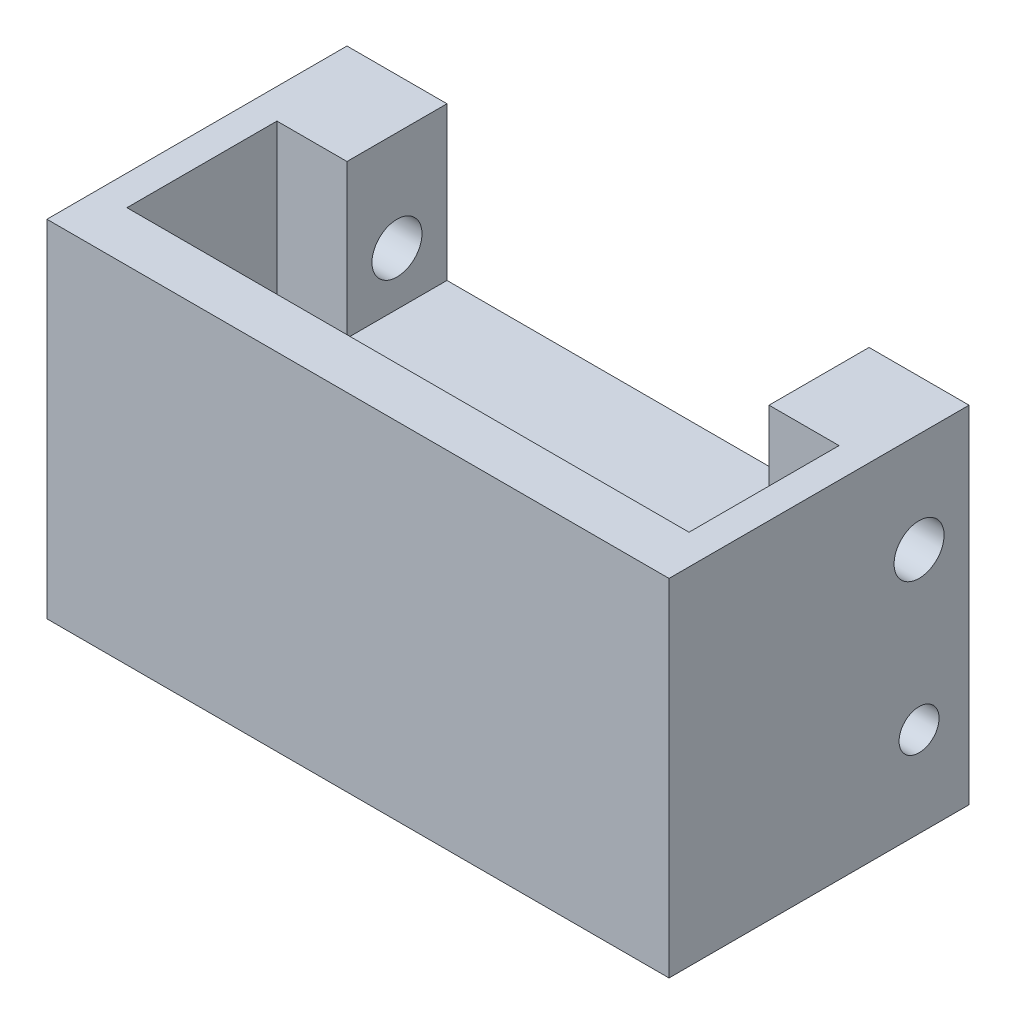
ISO-10303-21;
HEADER;
FILE_DESCRIPTION(('STEP AP214'),'2;1');
FILE_NAME('part.step','',(''),(''),'','','');
FILE_SCHEMA(('AUTOMOTIVE_DESIGN { 1 0 10303 214 1 1 1 1 }'));
ENDSEC;
DATA;
#1=APPLICATION_CONTEXT('core data for automotive mechanical design processes');
#2=APPLICATION_PROTOCOL_DEFINITION('international standard','automotive_design',2000,#1);
#3=PRODUCT_CONTEXT('',#1,'mechanical');
#4=PRODUCT('Part','Part','',(#3));
#5=PRODUCT_RELATED_PRODUCT_CATEGORY('part','',(#4));
#6=PRODUCT_DEFINITION_FORMATION('','',#4);
#7=PRODUCT_DEFINITION_CONTEXT('part definition',#1,'design');
#8=PRODUCT_DEFINITION('design','',#6,#7);
#9=PRODUCT_DEFINITION_SHAPE('','',#8);
#10=(LENGTH_UNIT() NAMED_UNIT(*) SI_UNIT(.MILLI.,.METRE.));
#11=(NAMED_UNIT(*) PLANE_ANGLE_UNIT() SI_UNIT($,.RADIAN.));
#12=(NAMED_UNIT(*) SI_UNIT($,.STERADIAN.) SOLID_ANGLE_UNIT());
#13=UNCERTAINTY_MEASURE_WITH_UNIT(LENGTH_MEASURE(1.E-05),#10,'distance_accuracy_value','');
#14=(GEOMETRIC_REPRESENTATION_CONTEXT(3) GLOBAL_UNCERTAINTY_ASSIGNED_CONTEXT((#13)) GLOBAL_UNIT_ASSIGNED_CONTEXT((#10,
#11,#12)) REPRESENTATION_CONTEXT('',''));
#15=CARTESIAN_POINT('',(0.,0.,0.));
#16=DIRECTION('',(0.,0.,1.));
#17=DIRECTION('',(1.,0.,0.));
#18=AXIS2_PLACEMENT_3D('',#15,#16,#17);
#19=CARTESIAN_POINT('',(0.,0.,12.7));
#20=DIRECTION('',(0.,0.,1.));
#21=DIRECTION('',(1.,0.,0.));
#22=AXIS2_PLACEMENT_3D('',#19,#20,#21);
#23=PLANE('',#22);
#24=DIRECTION('',(1.,0.,0.));
#25=VECTOR('',#24,1.);
#26=CARTESIAN_POINT('',(46.7087107438017,-11.952694214876,12.7));
#27=LINE('',#26,#25);
#28=CARTESIAN_POINT('',(46.7087107438017,-11.952694214876,12.7));
#29=VERTEX_POINT('',#28);
#30=CARTESIAN_POINT('',(55.5987107438017,-11.952694214876,12.7));
#31=VERTEX_POINT('',#30);
#32=EDGE_CURVE('E57',#29,#31,#27,.T.);
#33=ORIENTED_EDGE('',*,*,#32,.T.);
#34=DIRECTION('',(0.,-1.,0.));
#35=VECTOR('',#34,1.);
#36=CARTESIAN_POINT('',(55.5987107438017,31.989305785124,12.7));
#37=LINE('',#36,#35);
#38=CARTESIAN_POINT('',(55.5987107438017,31.989305785124,12.7));
#39=VERTEX_POINT('',#38);
#40=EDGE_CURVE('E189',#39,#31,#37,.T.);
#41=ORIENTED_EDGE('',*,*,#40,.F.);
#42=DIRECTION('',(-1.,0.,0.));
#43=VECTOR('',#42,1.);
#44=CARTESIAN_POINT('',(46.7087107438017,31.989305785124,12.7));
#45=LINE('',#44,#43);
#46=CARTESIAN_POINT('',(46.7087107438017,31.989305785124,12.7));
#47=VERTEX_POINT('',#46);
#48=EDGE_CURVE('E245',#39,#47,#45,.T.);
#49=ORIENTED_EDGE('',*,*,#48,.T.);
#50=DIRECTION('',(0.,-1.,0.));
#51=VECTOR('',#50,1.);
#52=CARTESIAN_POINT('',(46.7087107438017,31.989305785124,12.7));
#53=LINE('',#52,#51);
#54=CARTESIAN_POINT('',(46.7087107438017,12.558305785124,12.7));
#55=VERTEX_POINT('',#54);
#56=EDGE_CURVE('E238',#47,#55,#53,.T.);
#57=ORIENTED_EDGE('',*,*,#56,.T.);
#58=DIRECTION('',(-1.,0.,0.));
#59=VECTOR('',#58,1.);
#60=CARTESIAN_POINT('',(59.4107107438017,12.558305785124,12.7));
#61=LINE('',#60,#59);
#62=CARTESIAN_POINT('',(-6.88528925619834,12.558305785124,12.7));
#63=VERTEX_POINT('',#62);
#64=EDGE_CURVE('E283',#55,#63,#61,.T.);
#65=ORIENTED_EDGE('',*,*,#64,.T.);
#66=DIRECTION('',(0.,1.,0.));
#67=VECTOR('',#66,1.);
#68=CARTESIAN_POINT('',(-6.88528925619834,31.989305785124,12.7));
#69=LINE('',#68,#67);
#70=CARTESIAN_POINT('',(-6.88528925619834,31.989305785124,12.7));
#71=VERTEX_POINT('',#70);
#72=EDGE_CURVE('E319',#63,#71,#69,.T.);
#73=ORIENTED_EDGE('',*,*,#72,.T.);
#74=DIRECTION('',(-1.,0.,0.));
#75=VECTOR('',#74,1.);
#76=CARTESIAN_POINT('',(-19.5852892561983,31.989305785124,12.7));
#77=LINE('',#76,#75);
#78=CARTESIAN_POINT('',(-15.7752892561983,31.989305785124,12.7));
#79=VERTEX_POINT('',#78);
#80=EDGE_CURVE('E325',#71,#79,#77,.T.);
#81=ORIENTED_EDGE('',*,*,#80,.T.);
#82=DIRECTION('',(0.,1.,0.));
#83=VECTOR('',#82,1.);
#84=CARTESIAN_POINT('',(-15.7752892561983,31.989305785124,12.7));
#85=LINE('',#84,#83);
#86=CARTESIAN_POINT('',(-15.7752892561983,-11.952694214876,12.7));
#87=VERTEX_POINT('',#86);
#88=EDGE_CURVE('E64',#87,#79,#85,.T.);
#89=ORIENTED_EDGE('',*,*,#88,.F.);
#90=DIRECTION('',(1.,0.,0.));
#91=VECTOR('',#90,1.);
#92=CARTESIAN_POINT('',(-19.5852892561983,-11.952694214876,12.7));
#93=LINE('',#92,#91);
#94=CARTESIAN_POINT('',(-6.88528925619833,-11.952694214876,12.7));
#95=VERTEX_POINT('',#94);
#96=EDGE_CURVE('E316',#87,#95,#93,.T.);
#97=ORIENTED_EDGE('',*,*,#96,.T.);
#98=CARTESIAN_POINT('',(-6.88528925619834,7.47830578512398,12.7));
#99=VERTEX_POINT('',#98);
#100=EDGE_CURVE('E321',#95,#99,#69,.T.);
#101=ORIENTED_EDGE('',*,*,#100,.T.);
#102=DIRECTION('',(-1.,0.,0.));
#103=VECTOR('',#102,1.);
#104=CARTESIAN_POINT('',(59.4107107438017,7.478305785124,12.7));
#105=LINE('',#104,#103);
#106=CARTESIAN_POINT('',(46.7087107438017,7.478305785124,12.7));
#107=VERTEX_POINT('',#106);
#108=EDGE_CURVE('E284',#107,#99,#105,.T.);
#109=ORIENTED_EDGE('',*,*,#108,.F.);
#110=EDGE_CURVE('E242',#107,#29,#53,.T.);
#111=ORIENTED_EDGE('',*,*,#110,.T.);
#112=EDGE_LOOP('',(#33,#41,#49,#57,#65,#73,#81,#89,#97,#101,#109,#111));
#113=FACE_BOUND('',#112,.T.);
#114=ADVANCED_FACE('F39',(#113),#23,.T.);
#115=CARTESIAN_POINT('',(-6.88528925619834,31.989305785124,12.7));
#116=DIRECTION('',(-1.,0.,0.));
#117=DIRECTION('',(0.,-1.,0.));
#118=AXIS2_PLACEMENT_3D('',#115,#116,#117);
#119=PLANE('',#118);
#120=CARTESIAN_POINT('',(-6.88528925619834,19.289305785124,6.35));
#121=DIRECTION('',(-1.,0.,0.));
#122=DIRECTION('',(0.,-1.,0.));
#123=AXIS2_PLACEMENT_3D('',#120,#121,#122);
#124=CIRCLE('',#123,3.175);
#125=CARTESIAN_POINT('',(-6.88528925619834,16.114305785124,6.35));
#126=VERTEX_POINT('',#125);
#127=EDGE_CURVE('E43',#126,#126,#124,.T.);
#128=ORIENTED_EDGE('',*,*,#127,.T.);
#129=EDGE_LOOP('',(#128));
#130=FACE_BOUND('',#129,.T.);
#131=DIRECTION('',(0.,0.,1.));
#132=VECTOR('',#131,1.);
#133=CARTESIAN_POINT('',(-6.88528925619834,12.558305785124,12.7));
#134=LINE('',#133,#132);
#135=CARTESIAN_POINT('',(-6.88528925619834,12.558305785124,0.));
#136=VERTEX_POINT('',#135);
#137=EDGE_CURVE('E279',#136,#63,#134,.T.);
#138=ORIENTED_EDGE('',*,*,#137,.F.);
#139=DIRECTION('',(0.,1.,0.));
#140=VECTOR('',#139,1.);
#141=CARTESIAN_POINT('',(-6.88528925619834,31.989305785124,0.));
#142=LINE('',#141,#140);
#143=CARTESIAN_POINT('',(-6.88528925619834,31.989305785124,0.));
#144=VERTEX_POINT('',#143);
#145=EDGE_CURVE('E334',#136,#144,#142,.T.);
#146=ORIENTED_EDGE('',*,*,#145,.T.);
#147=DIRECTION('',(0.,0.,-1.));
#148=VECTOR('',#147,1.);
#149=CARTESIAN_POINT('',(-6.88528925619834,31.989305785124,12.7));
#150=LINE('',#149,#148);
#151=EDGE_CURVE('E342',#71,#144,#150,.T.);
#152=ORIENTED_EDGE('',*,*,#151,.F.);
#153=ORIENTED_EDGE('',*,*,#72,.F.);
#154=EDGE_LOOP('',(#138,#146,#152,#153));
#155=FACE_BOUND('',#154,.T.);
#156=ADVANCED_FACE('F356',(#130,#155),#119,.F.);
#157=CARTESIAN_POINT('',(-6.88528925619833,-0.522694214876018,6.35));
#158=DIRECTION('',(-1.,0.,0.));
#159=DIRECTION('',(0.,-1.,0.));
#160=AXIS2_PLACEMENT_3D('',#157,#158,#159);
#161=CIRCLE('',#160,2.54);
#162=CARTESIAN_POINT('',(-6.88528925619833,-3.06269421487602,6.35));
#163=VERTEX_POINT('',#162);
#164=EDGE_CURVE('E312',#163,#163,#161,.T.);
#165=ORIENTED_EDGE('',*,*,#164,.T.);
#166=EDGE_LOOP('',(#165));
#167=FACE_BOUND('',#166,.T.);
#168=DIRECTION('',(0.,0.,-1.));
#169=VECTOR('',#168,1.);
#170=CARTESIAN_POINT('',(-6.88528925619834,7.47830578512398,12.7));
#171=LINE('',#170,#169);
#172=CARTESIAN_POINT('',(-6.88528925619834,7.47830578512398,0.));
#173=VERTEX_POINT('',#172);
#174=EDGE_CURVE('E275',#99,#173,#171,.T.);
#175=ORIENTED_EDGE('',*,*,#174,.F.);
#176=ORIENTED_EDGE('',*,*,#100,.F.);
#177=DIRECTION('',(0.,0.,-1.));
#178=VECTOR('',#177,1.);
#179=CARTESIAN_POINT('',(-6.88528925619833,-11.952694214876,12.7));
#180=LINE('',#179,#178);
#181=CARTESIAN_POINT('',(-6.88528925619833,-11.952694214876,0.));
#182=VERTEX_POINT('',#181);
#183=EDGE_CURVE('E49',#95,#182,#180,.T.);
#184=ORIENTED_EDGE('',*,*,#183,.T.);
#185=EDGE_CURVE('E335',#182,#173,#142,.T.);
#186=ORIENTED_EDGE('',*,*,#185,.T.);
#187=EDGE_LOOP('',(#175,#176,#184,#186));
#188=FACE_BOUND('',#187,.T.);
#189=ADVANCED_FACE('F384',(#167,#188),#119,.F.);
#190=CARTESIAN_POINT('',(-19.5852892561983,31.989305785124,12.7));
#191=DIRECTION('',(1.,0.,0.));
#192=DIRECTION('',(0.,1.,0.));
#193=AXIS2_PLACEMENT_3D('',#190,#191,#192);
#194=PLANE('',#193);
#195=CARTESIAN_POINT('',(-19.5852892561983,19.289305785124,6.35));
#196=DIRECTION('',(-1.,0.,0.));
#197=DIRECTION('',(0.,-1.,0.));
#198=AXIS2_PLACEMENT_3D('',#195,#196,#197);
#199=CIRCLE('',#198,3.175);
#200=CARTESIAN_POINT('',(-19.5852892561983,16.114305785124,6.35));
#201=VERTEX_POINT('',#200);
#202=EDGE_CURVE('E308',#201,#201,#199,.T.);
#203=ORIENTED_EDGE('',*,*,#202,.F.);
#204=EDGE_LOOP('',(#203));
#205=FACE_BOUND('',#204,.T.);
#206=CARTESIAN_POINT('',(-19.5852892561983,-0.52269421487602,6.35));
#207=DIRECTION('',(-1.,0.,0.));
#208=DIRECTION('',(0.,-1.,0.));
#209=AXIS2_PLACEMENT_3D('',#206,#207,#208);
#210=CIRCLE('',#209,2.54);
#211=CARTESIAN_POINT('',(-19.5852892561983,-3.06269421487602,6.35));
#212=VERTEX_POINT('',#211);
#213=EDGE_CURVE('E304',#212,#212,#210,.T.);
#214=ORIENTED_EDGE('',*,*,#213,.F.);
#215=EDGE_LOOP('',(#214));
#216=FACE_BOUND('',#215,.T.);
#217=DIRECTION('',(0.,-1.,0.));
#218=VECTOR('',#217,1.);
#219=CARTESIAN_POINT('',(-19.5852892561983,31.989305785124,0.));
#220=LINE('',#219,#218);
#221=CARTESIAN_POINT('',(-19.5852892561983,31.989305785124,0.));
#222=VERTEX_POINT('',#221);
#223=CARTESIAN_POINT('',(-19.5852892561983,-11.952694214876,0.));
#224=VERTEX_POINT('',#223);
#225=EDGE_CURVE('E160',#222,#224,#220,.T.);
#226=ORIENTED_EDGE('',*,*,#225,.T.);
#227=DIRECTION('',(0.,0.,-1.));
#228=VECTOR('',#227,1.);
#229=CARTESIAN_POINT('',(-19.5852892561983,-11.952694214876,12.7));
#230=LINE('',#229,#228);
#231=CARTESIAN_POINT('',(-19.5852892561983,-11.952694214876,38.1));
#232=VERTEX_POINT('',#231);
#233=EDGE_CURVE('E11',#232,#224,#230,.T.);
#234=ORIENTED_EDGE('',*,*,#233,.F.);
#235=DIRECTION('',(0.,-1.,0.));
#236=VECTOR('',#235,1.);
#237=CARTESIAN_POINT('',(-19.5852892561983,31.989305785124,38.1));
#238=LINE('',#237,#236);
#239=CARTESIAN_POINT('',(-19.5852892561983,31.989305785124,38.1));
#240=VERTEX_POINT('',#239);
#241=EDGE_CURVE('E158',#240,#232,#238,.T.);
#242=ORIENTED_EDGE('',*,*,#241,.F.);
#243=DIRECTION('',(0.,0.,-1.));
#244=VECTOR('',#243,1.);
#245=CARTESIAN_POINT('',(-19.5852892561983,31.989305785124,12.7));
#246=LINE('',#245,#244);
#247=EDGE_CURVE('E328',#240,#222,#246,.T.);
#248=ORIENTED_EDGE('',*,*,#247,.T.);
#249=EDGE_LOOP('',(#226,#234,#242,#248));
#250=FACE_BOUND('',#249,.T.);
#251=ADVANCED_FACE('F41',(#205,#216,#250),#194,.F.);
#252=CARTESIAN_POINT('',(-19.5852892561983,-11.952694214876,12.7));
#253=DIRECTION('',(0.,1.,0.));
#254=DIRECTION('',(0.,0.,1.));
#255=AXIS2_PLACEMENT_3D('',#252,#253,#254);
#256=PLANE('',#255);
#257=DIRECTION('',(1.,0.,0.));
#258=VECTOR('',#257,1.);
#259=CARTESIAN_POINT('',(-19.5852892561983,-11.952694214876,0.));
#260=LINE('',#259,#258);
#261=EDGE_CURVE('E331',#224,#182,#260,.T.);
#262=ORIENTED_EDGE('',*,*,#261,.T.);
#263=ORIENTED_EDGE('',*,*,#183,.F.);
#264=ORIENTED_EDGE('',*,*,#96,.F.);
#265=DIRECTION('',(0.,0.,-1.));
#266=VECTOR('',#265,1.);
#267=CARTESIAN_POINT('',(-15.7752892561983,-11.952694214876,31.75));
#268=LINE('',#267,#266);
#269=CARTESIAN_POINT('',(-15.7752892561983,-11.952694214876,31.75));
#270=VERTEX_POINT('',#269);
#271=EDGE_CURVE('E217',#270,#87,#268,.T.);
#272=ORIENTED_EDGE('',*,*,#271,.F.);
#273=DIRECTION('',(1.,0.,0.));
#274=VECTOR('',#273,1.);
#275=CARTESIAN_POINT('',(-19.5852892561983,-11.952694214876,31.75));
#276=LINE('',#275,#274);
#277=CARTESIAN_POINT('',(55.5987107438017,-11.952694214876,31.75));
#278=VERTEX_POINT('',#277);
#279=EDGE_CURVE('E182',#270,#278,#276,.T.);
#280=ORIENTED_EDGE('',*,*,#279,.T.);
#281=DIRECTION('',(0.,0.,-1.));
#282=VECTOR('',#281,1.);
#283=CARTESIAN_POINT('',(55.5987107438017,-11.952694214876,31.75));
#284=LINE('',#283,#282);
#285=EDGE_CURVE('E197',#278,#31,#284,.T.);
#286=ORIENTED_EDGE('',*,*,#285,.T.);
#287=ORIENTED_EDGE('',*,*,#32,.F.);
#288=DIRECTION('',(0.,0.,-1.));
#289=VECTOR('',#288,1.);
#290=CARTESIAN_POINT('',(46.7087107438017,-11.952694214876,12.7));
#291=LINE('',#290,#289);
#292=CARTESIAN_POINT('',(46.7087107438017,-11.952694214876,0.));
#293=VERTEX_POINT('',#292);
#294=EDGE_CURVE('E271',#29,#293,#291,.T.);
#295=ORIENTED_EDGE('',*,*,#294,.T.);
#296=DIRECTION('',(1.,0.,0.));
#297=VECTOR('',#296,1.);
#298=CARTESIAN_POINT('',(46.7087107438017,-11.952694214876,0.));
#299=LINE('',#298,#297);
#300=CARTESIAN_POINT('',(59.4087107438017,-11.952694214876,0.));
#301=VERTEX_POINT('',#300);
#302=EDGE_CURVE('E253',#293,#301,#299,.T.);
#303=ORIENTED_EDGE('',*,*,#302,.T.);
#304=DIRECTION('',(0.,0.,-1.));
#305=VECTOR('',#304,1.);
#306=CARTESIAN_POINT('',(59.4087107438017,-11.952694214876,12.7));
#307=LINE('',#306,#305);
#308=CARTESIAN_POINT('',(59.4087107438017,-11.952694214876,38.1));
#309=VERTEX_POINT('',#308);
#310=EDGE_CURVE('E166',#309,#301,#307,.T.);
#311=ORIENTED_EDGE('',*,*,#310,.F.);
#312=DIRECTION('',(1.,0.,0.));
#313=VECTOR('',#312,1.);
#314=CARTESIAN_POINT('',(-19.5852892561983,-11.952694214876,38.1));
#315=LINE('',#314,#313);
#316=EDGE_CURVE('E163',#232,#309,#315,.T.);
#317=ORIENTED_EDGE('',*,*,#316,.F.);
#318=ORIENTED_EDGE('',*,*,#233,.T.);
#319=EDGE_LOOP('',(#262,#263,#264,#272,#280,#286,#287,#295,#303,#311,#317,#318));
#320=FACE_BOUND('',#319,.T.);
#321=ADVANCED_FACE('F164',(#320),#256,.F.);
#322=CARTESIAN_POINT('',(-19.5852892561983,31.989305785124,12.7));
#323=DIRECTION('',(0.,-1.,0.));
#324=DIRECTION('',(0.,0.,-1.));
#325=AXIS2_PLACEMENT_3D('',#322,#323,#324);
#326=PLANE('',#325);
#327=DIRECTION('',(-1.,0.,0.));
#328=VECTOR('',#327,1.);
#329=CARTESIAN_POINT('',(-19.5852892561983,31.989305785124,0.));
#330=LINE('',#329,#328);
#331=EDGE_CURVE('E320',#144,#222,#330,.T.);
#332=ORIENTED_EDGE('',*,*,#331,.T.);
#333=ORIENTED_EDGE('',*,*,#247,.F.);
#334=DIRECTION('',(-1.,0.,0.));
#335=VECTOR('',#334,1.);
#336=CARTESIAN_POINT('',(-19.5852892561983,31.989305785124,38.1));
#337=LINE('',#336,#335);
#338=CARTESIAN_POINT('',(59.4087107438017,31.989305785124,38.1));
#339=VERTEX_POINT('',#338);
#340=EDGE_CURVE('E176',#339,#240,#337,.T.);
#341=ORIENTED_EDGE('',*,*,#340,.F.);
#342=DIRECTION('',(0.,0.,-1.));
#343=VECTOR('',#342,1.);
#344=CARTESIAN_POINT('',(59.4087107438017,31.989305785124,12.7));
#345=LINE('',#344,#343);
#346=CARTESIAN_POINT('',(59.4087107438017,31.989305785124,0.));
#347=VERTEX_POINT('',#346);
#348=EDGE_CURVE('E265',#339,#347,#345,.T.);
#349=ORIENTED_EDGE('',*,*,#348,.T.);
#350=DIRECTION('',(-1.,0.,0.));
#351=VECTOR('',#350,1.);
#352=CARTESIAN_POINT('',(46.7087107438017,31.989305785124,0.));
#353=LINE('',#352,#351);
#354=CARTESIAN_POINT('',(46.7087107438017,31.989305785124,0.));
#355=VERTEX_POINT('',#354);
#356=EDGE_CURVE('E259',#347,#355,#353,.T.);
#357=ORIENTED_EDGE('',*,*,#356,.T.);
#358=DIRECTION('',(0.,0.,-1.));
#359=VECTOR('',#358,1.);
#360=CARTESIAN_POINT('',(46.7087107438017,31.989305785124,12.7));
#361=LINE('',#360,#359);
#362=EDGE_CURVE('E248',#47,#355,#361,.T.);
#363=ORIENTED_EDGE('',*,*,#362,.F.);
#364=ORIENTED_EDGE('',*,*,#48,.F.);
#365=DIRECTION('',(0.,0.,-1.));
#366=VECTOR('',#365,1.);
#367=CARTESIAN_POINT('',(55.5987107438017,31.989305785124,31.75));
#368=LINE('',#367,#366);
#369=CARTESIAN_POINT('',(55.5987107438017,31.989305785124,31.75));
#370=VERTEX_POINT('',#369);
#371=EDGE_CURVE('E203',#370,#39,#368,.T.);
#372=ORIENTED_EDGE('',*,*,#371,.F.);
#373=DIRECTION('',(-1.,0.,0.));
#374=VECTOR('',#373,1.);
#375=CARTESIAN_POINT('',(-19.5852892561983,31.989305785124,31.75));
#376=LINE('',#375,#374);
#377=CARTESIAN_POINT('',(-15.7752892561983,31.989305785124,31.75));
#378=VERTEX_POINT('',#377);
#379=EDGE_CURVE('E178',#370,#378,#376,.T.);
#380=ORIENTED_EDGE('',*,*,#379,.T.);
#381=DIRECTION('',(0.,0.,-1.));
#382=VECTOR('',#381,1.);
#383=CARTESIAN_POINT('',(-15.7752892561983,31.989305785124,31.75));
#384=LINE('',#383,#382);
#385=EDGE_CURVE('E211',#378,#79,#384,.T.);
#386=ORIENTED_EDGE('',*,*,#385,.T.);
#387=ORIENTED_EDGE('',*,*,#80,.F.);
#388=ORIENTED_EDGE('',*,*,#151,.T.);
#389=EDGE_LOOP('',(#332,#333,#341,#349,#357,#363,#364,#372,#380,#386,#387,#388));
#390=FACE_BOUND('',#389,.T.);
#391=ADVANCED_FACE('F389',(#390),#326,.F.);
#392=CARTESIAN_POINT('',(0.,0.,0.));
#393=DIRECTION('',(0.,0.,1.));
#394=DIRECTION('',(1.,0.,0.));
#395=AXIS2_PLACEMENT_3D('',#392,#393,#394);
#396=PLANE('',#395);
#397=ORIENTED_EDGE('',*,*,#225,.F.);
#398=ORIENTED_EDGE('',*,*,#331,.F.);
#399=ORIENTED_EDGE('',*,*,#145,.F.);
#400=DIRECTION('',(-1.,0.,0.));
#401=VECTOR('',#400,1.);
#402=CARTESIAN_POINT('',(59.4107107438017,12.558305785124,0.));
#403=LINE('',#402,#401);
#404=CARTESIAN_POINT('',(46.7087107438017,12.558305785124,0.));
#405=VERTEX_POINT('',#404);
#406=EDGE_CURVE('E293',#405,#136,#403,.T.);
#407=ORIENTED_EDGE('',*,*,#406,.F.);
#408=DIRECTION('',(0.,-1.,0.));
#409=VECTOR('',#408,1.);
#410=CARTESIAN_POINT('',(46.7087107438017,31.989305785124,0.));
#411=LINE('',#410,#409);
#412=EDGE_CURVE('E249',#355,#405,#411,.T.);
#413=ORIENTED_EDGE('',*,*,#412,.F.);
#414=ORIENTED_EDGE('',*,*,#356,.F.);
#415=DIRECTION('',(0.,1.,0.));
#416=VECTOR('',#415,1.);
#417=CARTESIAN_POINT('',(59.4087107438017,31.989305785124,0.));
#418=LINE('',#417,#416);
#419=EDGE_CURVE('E256',#301,#347,#418,.T.);
#420=ORIENTED_EDGE('',*,*,#419,.F.);
#421=ORIENTED_EDGE('',*,*,#302,.F.);
#422=CARTESIAN_POINT('',(46.7087107438017,7.478305785124,0.));
#423=VERTEX_POINT('',#422);
#424=EDGE_CURVE('E237',#423,#293,#411,.T.);
#425=ORIENTED_EDGE('',*,*,#424,.F.);
#426=DIRECTION('',(-1.,0.,0.));
#427=VECTOR('',#426,1.);
#428=CARTESIAN_POINT('',(59.4107107438017,7.478305785124,0.));
#429=LINE('',#428,#427);
#430=EDGE_CURVE('E289',#423,#173,#429,.T.);
#431=ORIENTED_EDGE('',*,*,#430,.T.);
#432=ORIENTED_EDGE('',*,*,#185,.F.);
#433=ORIENTED_EDGE('',*,*,#261,.F.);
#434=EDGE_LOOP('',(#397,#398,#399,#407,#413,#414,#420,#421,#425,#431,#432,#433));
#435=FACE_BOUND('',#434,.T.);
#436=ADVANCED_FACE('F373',(#435),#396,.F.);
#437=CARTESIAN_POINT('',(59.4087107438017,-0.522694214876008,6.35));
#438=DIRECTION('',(-1.,0.,0.));
#439=DIRECTION('',(0.,-1.,0.));
#440=AXIS2_PLACEMENT_3D('',#437,#438,#439);
#441=CYLINDRICAL_SURFACE('',#440,2.54);
#442=ORIENTED_EDGE('',*,*,#213,.T.);
#443=EDGE_LOOP('',(#442));
#444=FACE_BOUND('',#443,.T.);
#445=ORIENTED_EDGE('',*,*,#164,.F.);
#446=EDGE_LOOP('',(#445));
#447=FACE_BOUND('',#446,.T.);
#448=ADVANCED_FACE('F362',(#444,#447),#441,.F.);
#449=CARTESIAN_POINT('',(59.4087107438017,19.289305785124,6.35));
#450=DIRECTION('',(-1.,0.,0.));
#451=DIRECTION('',(0.,-1.,0.));
#452=AXIS2_PLACEMENT_3D('',#449,#450,#451);
#453=CYLINDRICAL_SURFACE('',#452,3.175);
#454=ORIENTED_EDGE('',*,*,#202,.T.);
#455=EDGE_LOOP('',(#454));
#456=FACE_BOUND('',#455,.T.);
#457=ORIENTED_EDGE('',*,*,#127,.F.);
#458=EDGE_LOOP('',(#457));
#459=FACE_BOUND('',#458,.T.);
#460=ADVANCED_FACE('F359',(#456,#459),#453,.F.);
#461=CARTESIAN_POINT('',(59.4107107438017,7.478305785124,12.7));
#462=DIRECTION('',(0.,1.,0.));
#463=DIRECTION('',(-1.,0.,0.));
#464=AXIS2_PLACEMENT_3D('',#461,#462,#463);
#465=PLANE('',#464);
#466=DIRECTION('',(0.,0.,-1.));
#467=VECTOR('',#466,1.);
#468=CARTESIAN_POINT('',(46.7087107438017,7.478305785124,12.7));
#469=LINE('',#468,#467);
#470=EDGE_CURVE('E288',#107,#423,#469,.T.);
#471=ORIENTED_EDGE('',*,*,#470,.F.);
#472=ORIENTED_EDGE('',*,*,#108,.T.);
#473=ORIENTED_EDGE('',*,*,#174,.T.);
#474=ORIENTED_EDGE('',*,*,#430,.F.);
#475=EDGE_LOOP('',(#471,#472,#473,#474));
#476=FACE_BOUND('',#475,.T.);
#477=ADVANCED_FACE('F361',(#476),#465,.F.);
#478=CARTESIAN_POINT('',(59.4107107438017,12.558305785124,12.7));
#479=DIRECTION('',(0.,-1.,0.));
#480=DIRECTION('',(1.,0.,0.));
#481=AXIS2_PLACEMENT_3D('',#478,#479,#480);
#482=PLANE('',#481);
#483=DIRECTION('',(0.,0.,1.));
#484=VECTOR('',#483,1.);
#485=CARTESIAN_POINT('',(46.7087107438017,12.558305785124,12.7));
#486=LINE('',#485,#484);
#487=EDGE_CURVE('E300',#405,#55,#486,.T.);
#488=ORIENTED_EDGE('',*,*,#487,.F.);
#489=ORIENTED_EDGE('',*,*,#406,.T.);
#490=ORIENTED_EDGE('',*,*,#137,.T.);
#491=ORIENTED_EDGE('',*,*,#64,.F.);
#492=EDGE_LOOP('',(#488,#489,#490,#491));
#493=FACE_BOUND('',#492,.T.);
#494=ADVANCED_FACE('F365',(#493),#482,.F.);
#495=CARTESIAN_POINT('',(46.7087107438017,31.989305785124,12.7));
#496=DIRECTION('',(1.,0.,0.));
#497=DIRECTION('',(0.,1.,0.));
#498=AXIS2_PLACEMENT_3D('',#495,#496,#497);
#499=PLANE('',#498);
#500=CARTESIAN_POINT('',(46.7087107438017,-0.52269421487601,6.35));
#501=DIRECTION('',(1.,0.,0.));
#502=DIRECTION('',(0.,1.,0.));
#503=AXIS2_PLACEMENT_3D('',#500,#501,#502);
#504=CIRCLE('',#503,2.54);
#505=CARTESIAN_POINT('',(46.7087107438017,2.01730578512399,6.35));
#506=VERTEX_POINT('',#505);
#507=EDGE_CURVE('E226',#506,#506,#504,.T.);
#508=ORIENTED_EDGE('',*,*,#507,.T.);
#509=EDGE_LOOP('',(#508));
#510=FACE_BOUND('',#509,.T.);
#511=ORIENTED_EDGE('',*,*,#110,.F.);
#512=ORIENTED_EDGE('',*,*,#470,.T.);
#513=ORIENTED_EDGE('',*,*,#424,.T.);
#514=ORIENTED_EDGE('',*,*,#294,.F.);
#515=EDGE_LOOP('',(#511,#512,#513,#514));
#516=FACE_BOUND('',#515,.T.);
#517=ADVANCED_FACE('F372',(#510,#516),#499,.F.);
#518=CARTESIAN_POINT('',(46.7087107438017,19.289305785124,6.35));
#519=DIRECTION('',(1.,0.,0.));
#520=DIRECTION('',(0.,1.,0.));
#521=AXIS2_PLACEMENT_3D('',#518,#519,#520);
#522=CIRCLE('',#521,3.175);
#523=CARTESIAN_POINT('',(46.7087107438017,22.464305785124,6.35));
#524=VERTEX_POINT('',#523);
#525=EDGE_CURVE('E233',#524,#524,#522,.T.);
#526=ORIENTED_EDGE('',*,*,#525,.T.);
#527=EDGE_LOOP('',(#526));
#528=FACE_BOUND('',#527,.T.);
#529=ORIENTED_EDGE('',*,*,#412,.T.);
#530=ORIENTED_EDGE('',*,*,#487,.T.);
#531=ORIENTED_EDGE('',*,*,#56,.F.);
#532=ORIENTED_EDGE('',*,*,#362,.T.);
#533=EDGE_LOOP('',(#529,#530,#531,#532));
#534=FACE_BOUND('',#533,.T.);
#535=ADVANCED_FACE('F432',(#528,#534),#499,.F.);
#536=CARTESIAN_POINT('',(59.4087107438017,31.989305785124,12.7));
#537=DIRECTION('',(-1.,0.,0.));
#538=DIRECTION('',(0.,-1.,0.));
#539=AXIS2_PLACEMENT_3D('',#536,#537,#538);
#540=PLANE('',#539);
#541=CARTESIAN_POINT('',(59.4087107438017,19.289305785124,6.35));
#542=DIRECTION('',(-1.,0.,0.));
#543=DIRECTION('',(0.,-1.,0.));
#544=AXIS2_PLACEMENT_3D('',#541,#542,#543);
#545=CIRCLE('',#544,3.175);
#546=CARTESIAN_POINT('',(59.4087107438017,16.114305785124,6.35));
#547=VERTEX_POINT('',#546);
#548=EDGE_CURVE('E222',#547,#547,#545,.T.);
#549=ORIENTED_EDGE('',*,*,#548,.T.);
#550=EDGE_LOOP('',(#549));
#551=FACE_BOUND('',#550,.T.);
#552=CARTESIAN_POINT('',(59.4087107438017,-0.522694214876008,6.35));
#553=DIRECTION('',(-1.,0.,0.));
#554=DIRECTION('',(0.,-1.,0.));
#555=AXIS2_PLACEMENT_3D('',#552,#553,#554);
#556=CIRCLE('',#555,2.54);
#557=CARTESIAN_POINT('',(59.4087107438017,-3.06269421487601,6.35));
#558=VERTEX_POINT('',#557);
#559=EDGE_CURVE('E221',#558,#558,#556,.T.);
#560=ORIENTED_EDGE('',*,*,#559,.T.);
#561=EDGE_LOOP('',(#560));
#562=FACE_BOUND('',#561,.T.);
#563=ORIENTED_EDGE('',*,*,#419,.T.);
#564=ORIENTED_EDGE('',*,*,#348,.F.);
#565=DIRECTION('',(0.,1.,0.));
#566=VECTOR('',#565,1.);
#567=CARTESIAN_POINT('',(59.4087107438017,31.989305785124,38.1));
#568=LINE('',#567,#566);
#569=EDGE_CURVE('E171',#309,#339,#568,.T.);
#570=ORIENTED_EDGE('',*,*,#569,.F.);
#571=ORIENTED_EDGE('',*,*,#310,.T.);
#572=EDGE_LOOP('',(#563,#564,#570,#571));
#573=FACE_BOUND('',#572,.T.);
#574=ADVANCED_FACE('F458',(#551,#562,#573),#540,.F.);
#575=CARTESIAN_POINT('',(59.4087107438017,-0.522694214876008,6.35));
#576=DIRECTION('',(-1.,0.,0.));
#577=DIRECTION('',(0.,-1.,0.));
#578=AXIS2_PLACEMENT_3D('',#575,#576,#577);
#579=CYLINDRICAL_SURFACE('',#578,2.54);
#580=ORIENTED_EDGE('',*,*,#559,.F.);
#581=EDGE_LOOP('',(#580));
#582=FACE_BOUND('',#581,.T.);
#583=ORIENTED_EDGE('',*,*,#507,.F.);
#584=EDGE_LOOP('',(#583));
#585=FACE_BOUND('',#584,.T.);
#586=ADVANCED_FACE('F451',(#582,#585),#579,.F.);
#587=CARTESIAN_POINT('',(59.4087107438017,19.289305785124,6.35));
#588=DIRECTION('',(-1.,0.,0.));
#589=DIRECTION('',(0.,-1.,0.));
#590=AXIS2_PLACEMENT_3D('',#587,#588,#589);
#591=CYLINDRICAL_SURFACE('',#590,3.175);
#592=ORIENTED_EDGE('',*,*,#548,.F.);
#593=EDGE_LOOP('',(#592));
#594=FACE_BOUND('',#593,.T.);
#595=ORIENTED_EDGE('',*,*,#525,.F.);
#596=EDGE_LOOP('',(#595));
#597=FACE_BOUND('',#596,.T.);
#598=ADVANCED_FACE('F444',(#594,#597),#591,.F.);
#599=CARTESIAN_POINT('',(-15.7752892561983,31.989305785124,31.75));
#600=DIRECTION('',(-1.,0.,0.));
#601=DIRECTION('',(0.,-1.,0.));
#602=AXIS2_PLACEMENT_3D('',#599,#600,#601);
#603=PLANE('',#602);
#604=ORIENTED_EDGE('',*,*,#88,.T.);
#605=ORIENTED_EDGE('',*,*,#385,.F.);
#606=DIRECTION('',(0.,1.,0.));
#607=VECTOR('',#606,1.);
#608=CARTESIAN_POINT('',(-15.7752892561983,31.989305785124,31.75));
#609=LINE('',#608,#607);
#610=EDGE_CURVE('E207',#270,#378,#609,.T.);
#611=ORIENTED_EDGE('',*,*,#610,.F.);
#612=ORIENTED_EDGE('',*,*,#271,.T.);
#613=EDGE_LOOP('',(#604,#605,#611,#612));
#614=FACE_BOUND('',#613,.T.);
#615=ADVANCED_FACE('F442',(#614),#603,.F.);
#616=CARTESIAN_POINT('',(55.5987107438017,31.989305785124,31.75));
#617=DIRECTION('',(1.,0.,0.));
#618=DIRECTION('',(0.,1.,0.));
#619=AXIS2_PLACEMENT_3D('',#616,#617,#618);
#620=PLANE('',#619);
#621=ORIENTED_EDGE('',*,*,#40,.T.);
#622=ORIENTED_EDGE('',*,*,#285,.F.);
#623=DIRECTION('',(0.,-1.,0.));
#624=VECTOR('',#623,1.);
#625=CARTESIAN_POINT('',(55.5987107438017,31.989305785124,31.75));
#626=LINE('',#625,#624);
#627=EDGE_CURVE('E193',#370,#278,#626,.T.);
#628=ORIENTED_EDGE('',*,*,#627,.F.);
#629=ORIENTED_EDGE('',*,*,#371,.T.);
#630=EDGE_LOOP('',(#621,#622,#628,#629));
#631=FACE_BOUND('',#630,.T.);
#632=ADVANCED_FACE('F423',(#631),#620,.F.);
#633=CARTESIAN_POINT('',(0.,0.,31.75));
#634=DIRECTION('',(0.,0.,1.));
#635=DIRECTION('',(1.,0.,0.));
#636=AXIS2_PLACEMENT_3D('',#633,#634,#635);
#637=PLANE('',#636);
#638=ORIENTED_EDGE('',*,*,#279,.F.);
#639=ORIENTED_EDGE('',*,*,#610,.T.);
#640=ORIENTED_EDGE('',*,*,#379,.F.);
#641=ORIENTED_EDGE('',*,*,#627,.T.);
#642=EDGE_LOOP('',(#638,#639,#640,#641));
#643=FACE_BOUND('',#642,.T.);
#644=ADVANCED_FACE('F426',(#643),#637,.F.);
#645=CARTESIAN_POINT('',(0.,0.,38.1));
#646=DIRECTION('',(0.,0.,1.));
#647=DIRECTION('',(1.,0.,0.));
#648=AXIS2_PLACEMENT_3D('',#645,#646,#647);
#649=PLANE('',#648);
#650=ORIENTED_EDGE('',*,*,#241,.T.);
#651=ORIENTED_EDGE('',*,*,#316,.T.);
#652=ORIENTED_EDGE('',*,*,#569,.T.);
#653=ORIENTED_EDGE('',*,*,#340,.T.);
#654=EDGE_LOOP('',(#650,#651,#652,#653));
#655=FACE_BOUND('',#654,.T.);
#656=ADVANCED_FACE('F174',(#655),#649,.T.);
#657=CLOSED_SHELL('',(#114,#156,#189,#251,#321,#391,#436,#448,#460,#477,#494,#517,#535,#574,
#586,#598,#615,#632,#644,#656));
#658=MANIFOLD_SOLID_BREP('B2',#657);
#659=ADVANCED_BREP_SHAPE_REPRESENTATION('',(#18,#658),#14);
#660=SHAPE_DEFINITION_REPRESENTATION(#9,#659);
ENDSEC;
END-ISO-10303-21;
